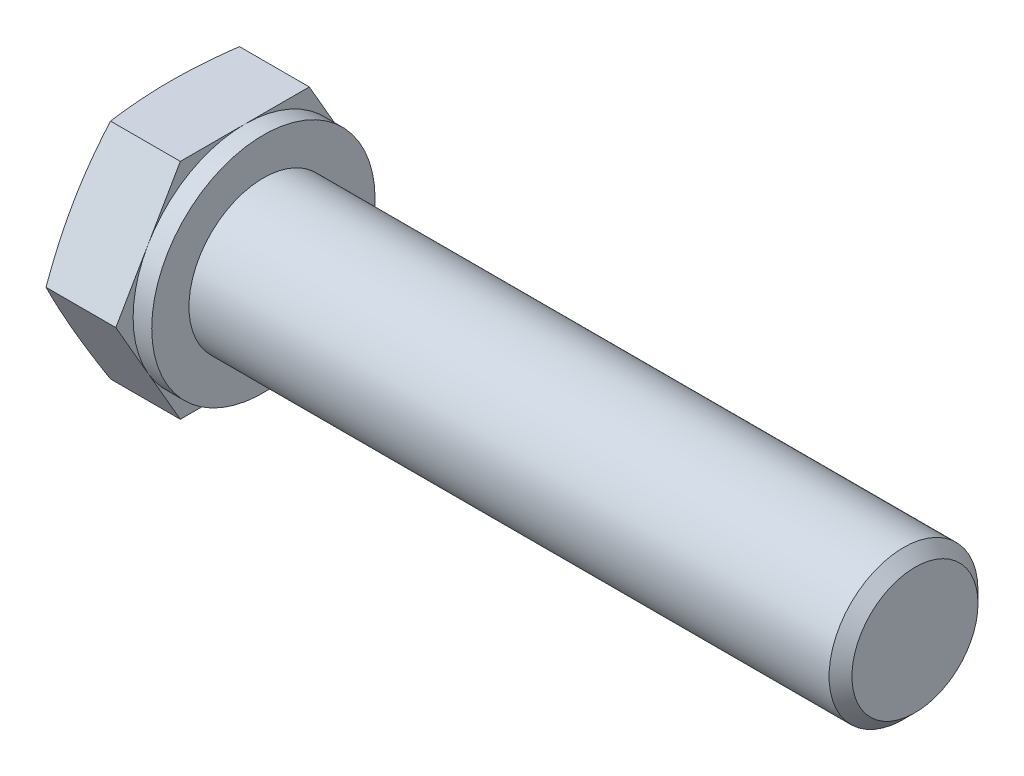
ISO-10303-21;
HEADER;
FILE_DESCRIPTION(('STEP AP214'),'2;1');
FILE_NAME('part.step','',(''),(''),'','','');
FILE_SCHEMA(('AUTOMOTIVE_DESIGN { 1 0 10303 214 1 1 1 1 }'));
ENDSEC;
DATA;
#1=APPLICATION_CONTEXT('core data for automotive mechanical design processes');
#2=APPLICATION_PROTOCOL_DEFINITION('international standard','automotive_design',2000,#1);
#3=PRODUCT_CONTEXT('',#1,'mechanical');
#4=PRODUCT('Part','Part','',(#3));
#5=PRODUCT_RELATED_PRODUCT_CATEGORY('part','',(#4));
#6=PRODUCT_DEFINITION_FORMATION('','',#4);
#7=PRODUCT_DEFINITION_CONTEXT('part definition',#1,'design');
#8=PRODUCT_DEFINITION('design','',#6,#7);
#9=PRODUCT_DEFINITION_SHAPE('','',#8);
#10=(LENGTH_UNIT() NAMED_UNIT(*) SI_UNIT(.MILLI.,.METRE.));
#11=(NAMED_UNIT(*) PLANE_ANGLE_UNIT() SI_UNIT($,.RADIAN.));
#12=(NAMED_UNIT(*) SI_UNIT($,.STERADIAN.) SOLID_ANGLE_UNIT());
#13=UNCERTAINTY_MEASURE_WITH_UNIT(LENGTH_MEASURE(1.E-05),#10,'distance_accuracy_value','');
#14=(GEOMETRIC_REPRESENTATION_CONTEXT(3) GLOBAL_UNCERTAINTY_ASSIGNED_CONTEXT((#13)) GLOBAL_UNIT_ASSIGNED_CONTEXT((#10,
#11,#12)) REPRESENTATION_CONTEXT('',''));
#15=CARTESIAN_POINT('',(0.,0.,0.));
#16=DIRECTION('',(0.,0.,1.));
#17=DIRECTION('',(1.,0.,0.));
#18=AXIS2_PLACEMENT_3D('',#15,#16,#17);
#19=CARTESIAN_POINT('',(10.,0.,13.856406460551));
#20=DIRECTION('',(0.,0.5,0.866025403784439));
#21=DIRECTION('',(1.,0.,0.));
#22=AXIS2_PLACEMENT_3D('',#19,#20,#21);
#23=PLANE('',#22);
#24=CARTESIAN_POINT('',(0.49742261192845,12.,6.9282032302755));
#25=CARTESIAN_POINT('',(0.25337690771278,10.4224637692121,7.8389941977773));
#26=CARTESIAN_POINT('',(0.131294031636191,8.99999999999998,8.66025403784438));
#27=CARTESIAN_POINT('',(0.,7.47021130957722,9.54347795006321));
#28=CARTESIAN_POINT('',(0.,5.99999999999998,10.3923048454133));
#29=B_SPLINE_CURVE_WITH_KNOTS('',2,(#24,#25,#26,#27,#28),.UNSPECIFIED.,.F.,.F.,(3,2,3),(0.,0.5,
1.),.UNSPECIFIED.);
#30=CARTESIAN_POINT('',(0.497422611928569,12.,6.92820323027551));
#31=VERTEX_POINT('',#30);
#32=CARTESIAN_POINT('',(0.,6.,10.3923048454133));
#33=VERTEX_POINT('',#32);
#34=EDGE_CURVE('E11',#31,#33,#29,.T.);
#35=ORIENTED_EDGE('',*,*,#34,.T.);
#36=CARTESIAN_POINT('',(0.,5.99999999999998,10.3923048454133));
#37=CARTESIAN_POINT('',(0.,4.53023836490945,11.2408721210774));
#38=CARTESIAN_POINT('',(0.131294031636191,2.99999999999998,12.1243556529821));
#39=CARTESIAN_POINT('',(0.25329635848283,1.5780569091953,12.9453148792305));
#40=CARTESIAN_POINT('',(0.49742261192845,0.,13.856406460551));
#41=B_SPLINE_CURVE_WITH_KNOTS('',2,(#36,#37,#38,#39,#40),.UNSPECIFIED.,.F.,.F.,(3,2,3),(0.,0.5,
1.),.UNSPECIFIED.);
#42=CARTESIAN_POINT('',(0.497422611928569,0.,13.856406460551));
#43=VERTEX_POINT('',#42);
#44=EDGE_CURVE('E29',#33,#43,#41,.T.);
#45=ORIENTED_EDGE('',*,*,#44,.T.);
#46=DIRECTION('',(-1.,0.,0.));
#47=VECTOR('',#46,1.);
#48=CARTESIAN_POINT('',(10.,0.,13.856406460551));
#49=LINE('',#48,#47);
#50=CARTESIAN_POINT('',(8.,0.,13.856406460551));
#51=VERTEX_POINT('',#50);
#52=EDGE_CURVE('E140',#51,#43,#49,.T.);
#53=ORIENTED_EDGE('',*,*,#52,.F.);
#54=DIRECTION('',(0.,0.866025403784439,-0.5));
#55=VECTOR('',#54,1.);
#56=CARTESIAN_POINT('',(8.,18.28125,3.30172185192817));
#57=LINE('',#56,#55);
#58=CARTESIAN_POINT('',(8.,6.,10.3923048454133));
#59=VERTEX_POINT('',#58);
#60=EDGE_CURVE('E143',#51,#59,#57,.T.);
#61=ORIENTED_EDGE('',*,*,#60,.T.);
#62=DIRECTION('',(0.,0.866025403784439,-0.5));
#63=VECTOR('',#62,1.);
#64=CARTESIAN_POINT('',(8.,18.28125,3.30172185192817));
#65=LINE('',#64,#63);
#66=CARTESIAN_POINT('',(8.,12.,6.92820323027551));
#67=VERTEX_POINT('',#66);
#68=EDGE_CURVE('E160',#59,#67,#65,.T.);
#69=ORIENTED_EDGE('',*,*,#68,.T.);
#70=DIRECTION('',(-1.,0.,0.));
#71=VECTOR('',#70,1.);
#72=CARTESIAN_POINT('',(10.,12.,6.92820323027551));
#73=LINE('',#72,#71);
#74=EDGE_CURVE('E299',#67,#31,#73,.T.);
#75=ORIENTED_EDGE('',*,*,#74,.T.);
#76=EDGE_LOOP('',(#35,#45,#53,#61,#69,#75));
#77=FACE_BOUND('',#76,.T.);
#78=ADVANCED_FACE('F16',(#77),#23,.T.);
#79=CARTESIAN_POINT('',(10.,-12.,6.92820323027551));
#80=DIRECTION('',(0.,-0.5,0.866025403784439));
#81=DIRECTION('',(-1.,0.,0.));
#82=AXIS2_PLACEMENT_3D('',#79,#80,#81);
#83=PLANE('',#82);
#84=CARTESIAN_POINT('',(0.49742261192845,0.,13.856406460551));
#85=CARTESIAN_POINT('',(0.253376907714091,-1.57753623077946,12.9456154930541));
#86=CARTESIAN_POINT('',(0.131294031636191,-3.,12.1243556529821));
#87=CARTESIAN_POINT('',(0.,-4.52978869041547,11.2411317407675));
#88=CARTESIAN_POINT('',(0.,-5.99999999999998,10.3923048454133));
#89=B_SPLINE_CURVE_WITH_KNOTS('',2,(#84,#85,#86,#87,#88),.UNSPECIFIED.,.F.,.F.,(3,2,3),(0.,0.5,
1.),.UNSPECIFIED.);
#90=CARTESIAN_POINT('',(0.,-6.,10.3923048454133));
#91=VERTEX_POINT('',#90);
#92=EDGE_CURVE('E296',#43,#91,#89,.T.);
#93=ORIENTED_EDGE('',*,*,#92,.T.);
#94=CARTESIAN_POINT('',(0.,-5.99999999999998,10.3923048454133));
#95=CARTESIAN_POINT('',(0.,-7.46976163505777,9.54373756976807));
#96=CARTESIAN_POINT('',(0.131294031636191,-9.,8.66025403784439));
#97=CARTESIAN_POINT('',(0.25329635847697,-10.4219430907668,7.83929481161785));
#98=CARTESIAN_POINT('',(0.49742261192845,-12.,6.92820323027551));
#99=B_SPLINE_CURVE_WITH_KNOTS('',2,(#94,#95,#96,#97,#98),.UNSPECIFIED.,.F.,.F.,(3,2,3),(0.,0.5,
1.),.UNSPECIFIED.);
#100=CARTESIAN_POINT('',(0.497422611928569,-12.,6.92820323027551));
#101=VERTEX_POINT('',#100);
#102=EDGE_CURVE('E171',#91,#101,#99,.T.);
#103=ORIENTED_EDGE('',*,*,#102,.T.);
#104=DIRECTION('',(-1.,0.,0.));
#105=VECTOR('',#104,1.);
#106=CARTESIAN_POINT('',(10.,-12.,6.92820323027551));
#107=LINE('',#106,#105);
#108=CARTESIAN_POINT('',(8.,-12.,6.92820323027551));
#109=VERTEX_POINT('',#108);
#110=EDGE_CURVE('E395',#109,#101,#107,.T.);
#111=ORIENTED_EDGE('',*,*,#110,.F.);
#112=DIRECTION('',(0.,0.866025403784439,0.5));
#113=VECTOR('',#112,1.);
#114=CARTESIAN_POINT('',(8.,6.28125,17.4828878388984));
#115=LINE('',#114,#113);
#116=CARTESIAN_POINT('',(8.,-6.,10.3923048454133));
#117=VERTEX_POINT('',#116);
#118=EDGE_CURVE('E164',#109,#117,#115,.T.);
#119=ORIENTED_EDGE('',*,*,#118,.T.);
#120=DIRECTION('',(0.,0.866025403784439,0.5));
#121=VECTOR('',#120,1.);
#122=CARTESIAN_POINT('',(8.,6.28125,17.4828878388984));
#123=LINE('',#122,#121);
#124=EDGE_CURVE('E151',#117,#51,#123,.T.);
#125=ORIENTED_EDGE('',*,*,#124,.T.);
#126=ORIENTED_EDGE('',*,*,#52,.T.);
#127=EDGE_LOOP('',(#93,#103,#111,#119,#125,#126));
#128=FACE_BOUND('',#127,.T.);
#129=ADVANCED_FACE('F162',(#128),#83,.T.);
#130=CARTESIAN_POINT('',(80.,6.773,0.));
#131=DIRECTION('',(-1.,0.,0.));
#132=DIRECTION('',(0.,0.,1.));
#133=AXIS2_PLACEMENT_3D('',#130,#131,#132);
#134=PLANE('',#133);
#135=CARTESIAN_POINT('',(80.,0.,0.));
#136=DIRECTION('',(1.,0.,0.));
#137=DIRECTION('',(0.,0.,-1.));
#138=AXIS2_PLACEMENT_3D('',#135,#136,#137);
#139=CIRCLE('',#138,6.773);
#140=CARTESIAN_POINT('',(80.,0.,-6.773));
#141=VERTEX_POINT('',#140);
#142=EDGE_CURVE('E152',#141,#141,#139,.T.);
#143=ORIENTED_EDGE('',*,*,#142,.T.);
#144=EDGE_LOOP('',(#143));
#145=FACE_BOUND('',#144,.T.);
#146=ADVANCED_FACE('F281',(#145),#134,.F.);
#147=CARTESIAN_POINT('',(78.773,0.,0.));
#148=DIRECTION('',(-1.,0.,0.));
#149=DIRECTION('',(0.,0.,1.));
#150=AXIS2_PLACEMENT_3D('',#147,#148,#149);
#151=CONICAL_SURFACE('',#150,8.,0.785398163397446);
#152=CARTESIAN_POINT('',(78.773,0.,0.));
#153=DIRECTION('',(1.,0.,0.));
#154=DIRECTION('',(0.,0.,-1.));
#155=AXIS2_PLACEMENT_3D('',#152,#153,#154);
#156=CIRCLE('',#155,8.);
#157=CARTESIAN_POINT('',(78.773,0.,-8.));
#158=VERTEX_POINT('',#157);
#159=EDGE_CURVE('E343',#158,#158,#156,.T.);
#160=ORIENTED_EDGE('',*,*,#159,.T.);
#161=EDGE_LOOP('',(#160));
#162=FACE_BOUND('',#161,.T.);
#163=ORIENTED_EDGE('',*,*,#142,.F.);
#164=EDGE_LOOP('',(#163));
#165=FACE_BOUND('',#164,.T.);
#166=ADVANCED_FACE('F494',(#162,#165),#151,.T.);
#167=CARTESIAN_POINT('',(80.,0.,0.));
#168=DIRECTION('',(-1.,0.,0.));
#169=DIRECTION('',(0.,0.,-1.));
#170=AXIS2_PLACEMENT_3D('',#167,#168,#169);
#171=CYLINDRICAL_SURFACE('',#170,8.);
#172=CARTESIAN_POINT('',(10.,0.,0.));
#173=DIRECTION('',(1.,0.,0.));
#174=DIRECTION('',(0.,0.,-1.));
#175=AXIS2_PLACEMENT_3D('',#172,#173,#174);
#176=CIRCLE('',#175,8.);
#177=CARTESIAN_POINT('',(10.,0.,-8.));
#178=VERTEX_POINT('',#177);
#179=EDGE_CURVE('E378',#178,#178,#176,.T.);
#180=ORIENTED_EDGE('',*,*,#179,.T.);
#181=EDGE_LOOP('',(#180));
#182=FACE_BOUND('',#181,.T.);
#183=ORIENTED_EDGE('',*,*,#159,.F.);
#184=EDGE_LOOP('',(#183));
#185=FACE_BOUND('',#184,.T.);
#186=ADVANCED_FACE('F18',(#182,#185),#171,.T.);
#187=CARTESIAN_POINT('',(10.,12.,0.));
#188=DIRECTION('',(-1.,0.,0.));
#189=DIRECTION('',(0.,0.,1.));
#190=AXIS2_PLACEMENT_3D('',#187,#188,#189);
#191=PLANE('',#190);
#192=CARTESIAN_POINT('',(10.,0.,0.));
#193=DIRECTION('',(1.,0.,0.));
#194=DIRECTION('',(0.,0.,-1.));
#195=AXIS2_PLACEMENT_3D('',#192,#193,#194);
#196=CIRCLE('',#195,12.);
#197=CARTESIAN_POINT('',(10.,0.,-12.));
#198=VERTEX_POINT('',#197);
#199=EDGE_CURVE('E374',#198,#198,#196,.T.);
#200=ORIENTED_EDGE('',*,*,#199,.T.);
#201=EDGE_LOOP('',(#200));
#202=FACE_BOUND('',#201,.T.);
#203=ORIENTED_EDGE('',*,*,#179,.F.);
#204=EDGE_LOOP('',(#203));
#205=FACE_BOUND('',#204,.T.);
#206=ADVANCED_FACE('F209',(#202,#205),#191,.F.);
#207=CARTESIAN_POINT('',(80.,0.,0.));
#208=DIRECTION('',(-1.,0.,0.));
#209=DIRECTION('',(0.,0.,-1.));
#210=AXIS2_PLACEMENT_3D('',#207,#208,#209);
#211=CYLINDRICAL_SURFACE('',#210,12.);
#212=CARTESIAN_POINT('',(8.,0.,0.));
#213=DIRECTION('',(1.,0.,0.));
#214=DIRECTION('',(0.,0.,-1.));
#215=AXIS2_PLACEMENT_3D('',#212,#213,#214);
#216=CIRCLE('',#215,12.);
#217=CARTESIAN_POINT('',(8.,12.,0.));
#218=VERTEX_POINT('',#217);
#219=EDGE_CURVE('E368',#218,#59,#216,.T.);
#220=ORIENTED_EDGE('',*,*,#219,.T.);
#221=CARTESIAN_POINT('',(8.,0.,0.));
#222=DIRECTION('',(1.,0.,0.));
#223=DIRECTION('',(0.,0.,-1.));
#224=AXIS2_PLACEMENT_3D('',#221,#222,#223);
#225=CIRCLE('',#224,12.);
#226=EDGE_CURVE('E158',#59,#117,#225,.T.);
#227=ORIENTED_EDGE('',*,*,#226,.T.);
#228=CARTESIAN_POINT('',(8.,0.,0.));
#229=DIRECTION('',(1.,0.,0.));
#230=DIRECTION('',(0.,0.,-1.));
#231=AXIS2_PLACEMENT_3D('',#228,#229,#230);
#232=CIRCLE('',#231,12.);
#233=CARTESIAN_POINT('',(8.,-12.,0.));
#234=VERTEX_POINT('',#233);
#235=EDGE_CURVE('E348',#117,#234,#232,.T.);
#236=ORIENTED_EDGE('',*,*,#235,.T.);
#237=CARTESIAN_POINT('',(8.,0.,0.));
#238=DIRECTION('',(1.,0.,0.));
#239=DIRECTION('',(0.,0.,-1.));
#240=AXIS2_PLACEMENT_3D('',#237,#238,#239);
#241=CIRCLE('',#240,12.);
#242=CARTESIAN_POINT('',(8.,-6.,-10.3923048454133));
#243=VERTEX_POINT('',#242);
#244=EDGE_CURVE('E320',#234,#243,#241,.T.);
#245=ORIENTED_EDGE('',*,*,#244,.T.);
#246=CARTESIAN_POINT('',(8.,0.,0.));
#247=DIRECTION('',(1.,0.,0.));
#248=DIRECTION('',(0.,0.,-1.));
#249=AXIS2_PLACEMENT_3D('',#246,#247,#248);
#250=CIRCLE('',#249,12.);
#251=CARTESIAN_POINT('',(8.,6.,-10.3923048454133));
#252=VERTEX_POINT('',#251);
#253=EDGE_CURVE('E181',#243,#252,#250,.T.);
#254=ORIENTED_EDGE('',*,*,#253,.T.);
#255=CARTESIAN_POINT('',(8.,0.,0.));
#256=DIRECTION('',(1.,0.,0.));
#257=DIRECTION('',(0.,0.,-1.));
#258=AXIS2_PLACEMENT_3D('',#255,#256,#257);
#259=CIRCLE('',#258,12.);
#260=EDGE_CURVE('E177',#252,#218,#259,.T.);
#261=ORIENTED_EDGE('',*,*,#260,.T.);
#262=EDGE_LOOP('',(#220,#227,#236,#245,#254,#261));
#263=FACE_BOUND('',#262,.T.);
#264=ORIENTED_EDGE('',*,*,#199,.F.);
#265=EDGE_LOOP('',(#264));
#266=FACE_BOUND('',#265,.T.);
#267=ADVANCED_FACE('F628',(#263,#266),#211,.T.);
#268=CARTESIAN_POINT('',(8.,16.375,0.));
#269=DIRECTION('',(-1.,0.,0.));
#270=DIRECTION('',(0.,0.,1.));
#271=AXIS2_PLACEMENT_3D('',#268,#269,#270);
#272=PLANE('',#271);
#273=DIRECTION('',(0.,-0.866025403784439,-0.5));
#274=VECTOR('',#273,1.);
#275=CARTESIAN_POINT('',(8.,18.28125,-3.30172185192817));
#276=LINE('',#275,#274);
#277=CARTESIAN_POINT('',(8.,12.,-6.92820323027551));
#278=VERTEX_POINT('',#277);
#279=EDGE_CURVE('E329',#278,#252,#276,.T.);
#280=ORIENTED_EDGE('',*,*,#279,.F.);
#281=DIRECTION('',(0.,0.,-1.));
#282=VECTOR('',#281,1.);
#283=CARTESIAN_POINT('',(8.,12.,0.));
#284=LINE('',#283,#282);
#285=EDGE_CURVE('E364',#218,#278,#284,.T.);
#286=ORIENTED_EDGE('',*,*,#285,.F.);
#287=ORIENTED_EDGE('',*,*,#260,.F.);
#288=EDGE_LOOP('',(#280,#286,#287));
#289=FACE_BOUND('',#288,.T.);
#290=ADVANCED_FACE('F533',(#289),#272,.F.);
#291=CARTESIAN_POINT('',(8.,16.375,0.));
#292=DIRECTION('',(-1.,0.,0.));
#293=DIRECTION('',(0.,0.,1.));
#294=AXIS2_PLACEMENT_3D('',#291,#292,#293);
#295=PLANE('',#294);
#296=DIRECTION('',(0.,-0.866025403784439,-0.5));
#297=VECTOR('',#296,1.);
#298=CARTESIAN_POINT('',(8.,18.28125,-3.30172185192817));
#299=LINE('',#298,#297);
#300=CARTESIAN_POINT('',(8.,0.,-13.856406460551));
#301=VERTEX_POINT('',#300);
#302=EDGE_CURVE('E326',#252,#301,#299,.T.);
#303=ORIENTED_EDGE('',*,*,#302,.F.);
#304=ORIENTED_EDGE('',*,*,#253,.F.);
#305=DIRECTION('',(0.,-0.866025403784439,0.5));
#306=VECTOR('',#305,1.);
#307=CARTESIAN_POINT('',(8.,6.28125,-17.4828878388984));
#308=LINE('',#307,#306);
#309=EDGE_CURVE('E183',#301,#243,#308,.T.);
#310=ORIENTED_EDGE('',*,*,#309,.F.);
#311=EDGE_LOOP('',(#303,#304,#310));
#312=FACE_BOUND('',#311,.T.);
#313=ADVANCED_FACE('F282',(#312),#295,.F.);
#314=CARTESIAN_POINT('',(8.,16.375,0.));
#315=DIRECTION('',(-1.,0.,0.));
#316=DIRECTION('',(0.,0.,1.));
#317=AXIS2_PLACEMENT_3D('',#314,#315,#316);
#318=PLANE('',#317);
#319=ORIENTED_EDGE('',*,*,#60,.F.);
#320=ORIENTED_EDGE('',*,*,#124,.F.);
#321=ORIENTED_EDGE('',*,*,#226,.F.);
#322=EDGE_LOOP('',(#319,#320,#321));
#323=FACE_BOUND('',#322,.T.);
#324=ADVANCED_FACE('F156',(#323),#318,.F.);
#325=CARTESIAN_POINT('',(8.,16.375,0.));
#326=DIRECTION('',(-1.,0.,0.));
#327=DIRECTION('',(0.,0.,1.));
#328=AXIS2_PLACEMENT_3D('',#325,#326,#327);
#329=PLANE('',#328);
#330=DIRECTION('',(0.,0.,1.));
#331=VECTOR('',#330,1.);
#332=CARTESIAN_POINT('',(8.,-12.,0.));
#333=LINE('',#332,#331);
#334=EDGE_CURVE('E391',#234,#109,#333,.T.);
#335=ORIENTED_EDGE('',*,*,#334,.F.);
#336=ORIENTED_EDGE('',*,*,#235,.F.);
#337=ORIENTED_EDGE('',*,*,#118,.F.);
#338=EDGE_LOOP('',(#335,#336,#337));
#339=FACE_BOUND('',#338,.T.);
#340=ADVANCED_FACE('F682',(#339),#329,.F.);
#341=CARTESIAN_POINT('',(8.,16.375,0.));
#342=DIRECTION('',(-1.,0.,0.));
#343=DIRECTION('',(0.,0.,1.));
#344=AXIS2_PLACEMENT_3D('',#341,#342,#343);
#345=PLANE('',#344);
#346=DIRECTION('',(0.,0.,-1.));
#347=VECTOR('',#346,1.);
#348=CARTESIAN_POINT('',(8.,12.,0.));
#349=LINE('',#348,#347);
#350=EDGE_CURVE('E360',#67,#218,#349,.T.);
#351=ORIENTED_EDGE('',*,*,#350,.F.);
#352=ORIENTED_EDGE('',*,*,#68,.F.);
#353=ORIENTED_EDGE('',*,*,#219,.F.);
#354=EDGE_LOOP('',(#351,#352,#353));
#355=FACE_BOUND('',#354,.T.);
#356=ADVANCED_FACE('F242',(#355),#345,.F.);
#357=CARTESIAN_POINT('',(10.,-12.,-6.92820323027551));
#358=DIRECTION('',(0.,-1.,0.));
#359=DIRECTION('',(0.,0.,-1.));
#360=AXIS2_PLACEMENT_3D('',#357,#358,#359);
#361=PLANE('',#360);
#362=CARTESIAN_POINT('',(0.497422611928569,-12.,6.92820323027551));
#363=CARTESIAN_POINT('',(0.253624152408091,-12.,5.10846675480059));
#364=CARTESIAN_POINT('',(0.1315456929334,-12.,3.46748646847153));
#365=CARTESIAN_POINT('',(0.,-12.,1.69924750326774));
#366=CARTESIAN_POINT('',(0.,-12.,0.));
#367=B_SPLINE_CURVE_WITH_KNOTS('',2,(#362,#363,#364,#365,#366),.UNSPECIFIED.,.F.,.F.,(3,2,3),
(0.,0.5,1.),.UNSPECIFIED.);
#368=CARTESIAN_POINT('',(0.,-12.,0.));
#369=VERTEX_POINT('',#368);
#370=EDGE_CURVE('E182',#101,#369,#367,.T.);
#371=ORIENTED_EDGE('',*,*,#370,.T.);
#372=CARTESIAN_POINT('',(0.,-12.,0.));
#373=CARTESIAN_POINT('',(0.,-12.,-1.69667649674607));
#374=CARTESIAN_POINT('',(0.131221771964779,-12.,-3.46312915573398));
#375=CARTESIAN_POINT('',(0.253225302137221,-12.,-5.10548969584963));
#376=CARTESIAN_POINT('',(0.497422611928569,-12.,-6.92820323027551));
#377=B_SPLINE_CURVE_WITH_KNOTS('',2,(#372,#373,#374,#375,#376),.UNSPECIFIED.,.F.,.F.,(3,2,3),
(0.,0.5,1.),.UNSPECIFIED.);
#378=CARTESIAN_POINT('',(0.497422611928569,-12.,-6.92820323027551));
#379=VERTEX_POINT('',#378);
#380=EDGE_CURVE('E459',#369,#379,#377,.T.);
#381=ORIENTED_EDGE('',*,*,#380,.T.);
#382=DIRECTION('',(-1.,0.,0.));
#383=VECTOR('',#382,1.);
#384=CARTESIAN_POINT('',(10.,-12.,-6.92820323027551));
#385=LINE('',#384,#383);
#386=CARTESIAN_POINT('',(8.,-12.,-6.92820323027551));
#387=VERTEX_POINT('',#386);
#388=EDGE_CURVE('E389',#387,#379,#385,.T.);
#389=ORIENTED_EDGE('',*,*,#388,.F.);
#390=DIRECTION('',(0.,0.,1.));
#391=VECTOR('',#390,1.);
#392=CARTESIAN_POINT('',(8.,-12.,0.));
#393=LINE('',#392,#391);
#394=EDGE_CURVE('E394',#387,#234,#393,.T.);
#395=ORIENTED_EDGE('',*,*,#394,.T.);
#396=ORIENTED_EDGE('',*,*,#334,.T.);
#397=ORIENTED_EDGE('',*,*,#110,.T.);
#398=EDGE_LOOP('',(#371,#381,#389,#395,#396,#397));
#399=FACE_BOUND('',#398,.T.);
#400=ADVANCED_FACE('F206',(#399),#361,.T.);
#401=CARTESIAN_POINT('',(10.,0.,-13.856406460551));
#402=DIRECTION('',(0.,-0.5,-0.866025403784439));
#403=DIRECTION('',(0.,-0.866025403784439,0.5));
#404=AXIS2_PLACEMENT_3D('',#401,#402,#403);
#405=PLANE('',#404);
#406=CARTESIAN_POINT('',(0.497422611928446,-12.,-6.9282032302755));
#407=CARTESIAN_POINT('',(0.253376907712776,-10.4224637692121,-7.8389941977773));
#408=CARTESIAN_POINT('',(0.131294031636175,-8.99999999999998,-8.66025403784438));
#409=CARTESIAN_POINT('',(0.,-7.47021130957722,-9.54347795006321));
#410=CARTESIAN_POINT('',(0.,-5.99999999999998,-10.3923048454133));
#411=B_SPLINE_CURVE_WITH_KNOTS('',2,(#406,#407,#408,#409,#410),.UNSPECIFIED.,.F.,.F.,(3,2,3),
(0.,0.5,1.),.UNSPECIFIED.);
#412=CARTESIAN_POINT('',(0.,-6.,-10.3923048454133));
#413=VERTEX_POINT('',#412);
#414=EDGE_CURVE('E373',#379,#413,#411,.T.);
#415=ORIENTED_EDGE('',*,*,#414,.T.);
#416=CARTESIAN_POINT('',(0.,-5.99999999999998,-10.3923048454133));
#417=CARTESIAN_POINT('',(0.,-4.53023836490945,-11.2408721210774));
#418=CARTESIAN_POINT('',(0.131294031636175,-2.99999999999998,-12.1243556529821));
#419=CARTESIAN_POINT('',(0.253296358482827,-1.5780569091953,-12.9453148792305));
#420=CARTESIAN_POINT('',(0.497422611928446,0.,-13.856406460551));
#421=B_SPLINE_CURVE_WITH_KNOTS('',2,(#416,#417,#418,#419,#420),.UNSPECIFIED.,.F.,.F.,(3,2,3),
(0.,0.5,1.),.UNSPECIFIED.);
#422=CARTESIAN_POINT('',(0.497422611928569,0.,-13.856406460551));
#423=VERTEX_POINT('',#422);
#424=EDGE_CURVE('E187',#413,#423,#421,.T.);
#425=ORIENTED_EDGE('',*,*,#424,.T.);
#426=DIRECTION('',(-1.,0.,0.));
#427=VECTOR('',#426,1.);
#428=CARTESIAN_POINT('',(10.,0.,-13.856406460551));
#429=LINE('',#428,#427);
#430=EDGE_CURVE('E330',#301,#423,#429,.T.);
#431=ORIENTED_EDGE('',*,*,#430,.F.);
#432=ORIENTED_EDGE('',*,*,#309,.T.);
#433=DIRECTION('',(0.,-0.866025403784439,0.5));
#434=VECTOR('',#433,1.);
#435=CARTESIAN_POINT('',(8.,6.28125,-17.4828878388984));
#436=LINE('',#435,#434);
#437=EDGE_CURVE('E175',#243,#387,#436,.T.);
#438=ORIENTED_EDGE('',*,*,#437,.T.);
#439=ORIENTED_EDGE('',*,*,#388,.T.);
#440=EDGE_LOOP('',(#415,#425,#431,#432,#438,#439));
#441=FACE_BOUND('',#440,.T.);
#442=ADVANCED_FACE('F432',(#441),#405,.T.);
#443=CARTESIAN_POINT('',(0.,0.,0.));
#444=DIRECTION('',(1.,0.,0.));
#445=DIRECTION('',(0.,0.,-1.));
#446=AXIS2_PLACEMENT_3D('',#443,#444,#445);
#447=CONICAL_SURFACE('',#446,12.,1.30899693899574);
#448=ORIENTED_EDGE('',*,*,#380,.F.);
#449=CARTESIAN_POINT('',(0.,0.,0.));
#450=DIRECTION('',(1.,0.,0.));
#451=DIRECTION('',(0.,0.,-1.));
#452=AXIS2_PLACEMENT_3D('',#449,#450,#451);
#453=CIRCLE('',#452,12.);
#454=EDGE_CURVE('E303',#369,#413,#453,.T.);
#455=ORIENTED_EDGE('',*,*,#454,.T.);
#456=ORIENTED_EDGE('',*,*,#414,.F.);
#457=EDGE_LOOP('',(#448,#455,#456));
#458=FACE_BOUND('',#457,.T.);
#459=ADVANCED_FACE('F441',(#458),#447,.T.);
#460=CARTESIAN_POINT('',(0.,0.,0.));
#461=DIRECTION('',(1.,0.,0.));
#462=DIRECTION('',(0.,0.,-1.));
#463=AXIS2_PLACEMENT_3D('',#460,#461,#462);
#464=CONICAL_SURFACE('',#463,12.,1.30899693899574);
#465=ORIENTED_EDGE('',*,*,#424,.F.);
#466=CARTESIAN_POINT('',(0.,0.,0.));
#467=DIRECTION('',(1.,0.,0.));
#468=DIRECTION('',(0.,0.,-1.));
#469=AXIS2_PLACEMENT_3D('',#466,#467,#468);
#470=CIRCLE('',#469,12.);
#471=CARTESIAN_POINT('',(0.,6.,-10.3923048454133));
#472=VERTEX_POINT('',#471);
#473=EDGE_CURVE('E324',#413,#472,#470,.T.);
#474=ORIENTED_EDGE('',*,*,#473,.T.);
#475=CARTESIAN_POINT('',(0.49742261192845,0.,-13.856406460551));
#476=CARTESIAN_POINT('',(0.253376907714091,1.57753623077946,-12.9456154930541));
#477=CARTESIAN_POINT('',(0.131294031636191,3.,-12.1243556529821));
#478=CARTESIAN_POINT('',(0.,4.52978869041547,-11.2411317407675));
#479=CARTESIAN_POINT('',(0.,5.99999999999998,-10.3923048454133));
#480=B_SPLINE_CURVE_WITH_KNOTS('',2,(#475,#476,#477,#478,#479),.UNSPECIFIED.,.F.,.F.,(3,2,3),
(0.,0.5,1.),.UNSPECIFIED.);
#481=EDGE_CURVE('E314',#423,#472,#480,.T.);
#482=ORIENTED_EDGE('',*,*,#481,.F.);
#483=EDGE_LOOP('',(#465,#474,#482));
#484=FACE_BOUND('',#483,.T.);
#485=ADVANCED_FACE('F238',(#484),#464,.T.);
#486=CARTESIAN_POINT('',(0.,0.,0.));
#487=DIRECTION('',(1.,0.,0.));
#488=DIRECTION('',(0.,0.,-1.));
#489=AXIS2_PLACEMENT_3D('',#486,#487,#488);
#490=CONICAL_SURFACE('',#489,12.,1.30899693899574);
#491=ORIENTED_EDGE('',*,*,#44,.F.);
#492=CARTESIAN_POINT('',(0.,0.,0.));
#493=DIRECTION('',(1.,0.,0.));
#494=DIRECTION('',(0.,0.,-1.));
#495=AXIS2_PLACEMENT_3D('',#492,#493,#494);
#496=CIRCLE('',#495,12.);
#497=EDGE_CURVE('E41',#33,#91,#496,.T.);
#498=ORIENTED_EDGE('',*,*,#497,.T.);
#499=ORIENTED_EDGE('',*,*,#92,.F.);
#500=EDGE_LOOP('',(#491,#498,#499));
#501=FACE_BOUND('',#500,.T.);
#502=ADVANCED_FACE('F228',(#501),#490,.T.);
#503=CARTESIAN_POINT('',(0.,0.,0.));
#504=DIRECTION('',(1.,0.,0.));
#505=DIRECTION('',(0.,0.,-1.));
#506=AXIS2_PLACEMENT_3D('',#503,#504,#505);
#507=CONICAL_SURFACE('',#506,12.,1.30899693899574);
#508=ORIENTED_EDGE('',*,*,#370,.F.);
#509=ORIENTED_EDGE('',*,*,#102,.F.);
#510=CARTESIAN_POINT('',(0.,0.,0.));
#511=DIRECTION('',(1.,0.,0.));
#512=DIRECTION('',(0.,0.,-1.));
#513=AXIS2_PLACEMENT_3D('',#510,#511,#512);
#514=CIRCLE('',#513,12.);
#515=EDGE_CURVE('E251',#91,#369,#514,.T.);
#516=ORIENTED_EDGE('',*,*,#515,.T.);
#517=EDGE_LOOP('',(#508,#509,#516));
#518=FACE_BOUND('',#517,.T.);
#519=ADVANCED_FACE('F237',(#518),#507,.T.);
#520=CARTESIAN_POINT('',(0.,0.,0.));
#521=DIRECTION('',(1.,0.,0.));
#522=DIRECTION('',(0.,1.,0.));
#523=AXIS2_PLACEMENT_3D('',#520,#521,#522);
#524=PLANE('',#523);
#525=CARTESIAN_POINT('',(0.,0.,0.));
#526=DIRECTION('',(1.,0.,0.));
#527=DIRECTION('',(0.,0.,-1.));
#528=AXIS2_PLACEMENT_3D('',#525,#526,#527);
#529=CIRCLE('',#528,12.);
#530=CARTESIAN_POINT('',(0.,12.,0.));
#531=VERTEX_POINT('',#530);
#532=EDGE_CURVE('E332',#531,#33,#529,.T.);
#533=ORIENTED_EDGE('',*,*,#532,.F.);
#534=CARTESIAN_POINT('',(0.,0.,0.));
#535=DIRECTION('',(1.,0.,0.));
#536=DIRECTION('',(0.,0.,-1.));
#537=AXIS2_PLACEMENT_3D('',#534,#535,#536);
#538=CIRCLE('',#537,12.);
#539=EDGE_CURVE('E260',#472,#531,#538,.T.);
#540=ORIENTED_EDGE('',*,*,#539,.F.);
#541=ORIENTED_EDGE('',*,*,#473,.F.);
#542=ORIENTED_EDGE('',*,*,#454,.F.);
#543=ORIENTED_EDGE('',*,*,#515,.F.);
#544=ORIENTED_EDGE('',*,*,#497,.F.);
#545=EDGE_LOOP('',(#533,#540,#541,#542,#543,#544));
#546=FACE_BOUND('',#545,.T.);
#547=ADVANCED_FACE('F300',(#546),#524,.F.);
#548=CARTESIAN_POINT('',(0.,0.,0.));
#549=DIRECTION('',(1.,0.,0.));
#550=DIRECTION('',(0.,0.,-1.));
#551=AXIS2_PLACEMENT_3D('',#548,#549,#550);
#552=CONICAL_SURFACE('',#551,12.,1.30899693899574);
#553=CARTESIAN_POINT('',(0.,5.99999999999998,-10.3923048454133));
#554=CARTESIAN_POINT('',(0.,7.46976163506143,-9.54373756976596));
#555=CARTESIAN_POINT('',(0.131294031636191,9.00000000000001,-8.66025403784438));
#556=CARTESIAN_POINT('',(0.253296358477621,10.421943090771,-7.83929481161541));
#557=CARTESIAN_POINT('',(0.49742261192845,12.,-6.92820323027551));
#558=B_SPLINE_CURVE_WITH_KNOTS('',2,(#553,#554,#555,#556,#557),.UNSPECIFIED.,.F.,.F.,(3,2,3),
(0.,0.5,1.),.UNSPECIFIED.);
#559=CARTESIAN_POINT('',(0.497422611928569,12.,-6.92820323027551));
#560=VERTEX_POINT('',#559);
#561=EDGE_CURVE('E520',#472,#560,#558,.T.);
#562=ORIENTED_EDGE('',*,*,#561,.F.);
#563=ORIENTED_EDGE('',*,*,#539,.T.);
#564=CARTESIAN_POINT('',(0.497422611928569,12.,-6.92820323027551));
#565=CARTESIAN_POINT('',(0.253306105500921,12.,-5.10609282036709));
#566=CARTESIAN_POINT('',(0.131221771964779,12.,-3.46312915573399));
#567=CARTESIAN_POINT('',(0.,12.,-1.69719738461854));
#568=CARTESIAN_POINT('',(0.,12.,0.));
#569=B_SPLINE_CURVE_WITH_KNOTS('',2,(#564,#565,#566,#567,#568),.UNSPECIFIED.,.F.,.F.,(3,2,3),
(0.,0.5,1.),.UNSPECIFIED.);
#570=EDGE_CURVE('E335',#560,#531,#569,.T.);
#571=ORIENTED_EDGE('',*,*,#570,.F.);
#572=EDGE_LOOP('',(#562,#563,#571));
#573=FACE_BOUND('',#572,.T.);
#574=ADVANCED_FACE('F239',(#573),#552,.T.);
#575=CARTESIAN_POINT('',(0.,0.,0.));
#576=DIRECTION('',(1.,0.,0.));
#577=DIRECTION('',(0.,0.,-1.));
#578=AXIS2_PLACEMENT_3D('',#575,#576,#577);
#579=CONICAL_SURFACE('',#578,12.,1.30899693899574);
#580=CARTESIAN_POINT('',(0.,12.,0.));
#581=CARTESIAN_POINT('',(0.,12.,1.69872759164872));
#582=CARTESIAN_POINT('',(0.1315456929334,12.,3.46748646847153));
#583=CARTESIAN_POINT('',(0.25354349293356,12.,5.10786470428649));
#584=CARTESIAN_POINT('',(0.497422611928569,12.,6.92820323027551));
#585=B_SPLINE_CURVE_WITH_KNOTS('',2,(#580,#581,#582,#583,#584),.UNSPECIFIED.,.F.,.F.,(3,2,3),
(0.,0.5,1.),.UNSPECIFIED.);
#586=EDGE_CURVE('E352',#531,#31,#585,.T.);
#587=ORIENTED_EDGE('',*,*,#586,.F.);
#588=ORIENTED_EDGE('',*,*,#532,.T.);
#589=ORIENTED_EDGE('',*,*,#34,.F.);
#590=EDGE_LOOP('',(#587,#588,#589));
#591=FACE_BOUND('',#590,.T.);
#592=ADVANCED_FACE('F284',(#591),#579,.T.);
#593=CARTESIAN_POINT('',(10.,12.,6.92820323027551));
#594=DIRECTION('',(0.,1.,0.));
#595=DIRECTION('',(1.,0.,0.));
#596=AXIS2_PLACEMENT_3D('',#593,#594,#595);
#597=PLANE('',#596);
#598=ORIENTED_EDGE('',*,*,#570,.T.);
#599=ORIENTED_EDGE('',*,*,#586,.T.);
#600=ORIENTED_EDGE('',*,*,#74,.F.);
#601=ORIENTED_EDGE('',*,*,#350,.T.);
#602=ORIENTED_EDGE('',*,*,#285,.T.);
#603=DIRECTION('',(-1.,0.,0.));
#604=VECTOR('',#603,1.);
#605=CARTESIAN_POINT('',(10.,12.,-6.92820323027551));
#606=LINE('',#605,#604);
#607=EDGE_CURVE('E573',#278,#560,#606,.T.);
#608=ORIENTED_EDGE('',*,*,#607,.T.);
#609=EDGE_LOOP('',(#598,#599,#600,#601,#602,#608));
#610=FACE_BOUND('',#609,.T.);
#611=ADVANCED_FACE('F442',(#610),#597,.T.);
#612=CARTESIAN_POINT('',(10.,12.,-6.92820323027551));
#613=DIRECTION('',(0.,0.5,-0.866025403784439));
#614=DIRECTION('',(-1.,0.,0.));
#615=AXIS2_PLACEMENT_3D('',#612,#613,#614);
#616=PLANE('',#615);
#617=ORIENTED_EDGE('',*,*,#481,.T.);
#618=ORIENTED_EDGE('',*,*,#561,.T.);
#619=ORIENTED_EDGE('',*,*,#607,.F.);
#620=ORIENTED_EDGE('',*,*,#279,.T.);
#621=ORIENTED_EDGE('',*,*,#302,.T.);
#622=ORIENTED_EDGE('',*,*,#430,.T.);
#623=EDGE_LOOP('',(#617,#618,#619,#620,#621,#622));
#624=FACE_BOUND('',#623,.T.);
#625=ADVANCED_FACE('F524',(#624),#616,.T.);
#626=CARTESIAN_POINT('',(8.,16.375,0.));
#627=DIRECTION('',(-1.,0.,0.));
#628=DIRECTION('',(0.,0.,1.));
#629=AXIS2_PLACEMENT_3D('',#626,#627,#628);
#630=PLANE('',#629);
#631=ORIENTED_EDGE('',*,*,#437,.F.);
#632=ORIENTED_EDGE('',*,*,#244,.F.);
#633=ORIENTED_EDGE('',*,*,#394,.F.);
#634=EDGE_LOOP('',(#631,#632,#633));
#635=FACE_BOUND('',#634,.T.);
#636=ADVANCED_FACE('F532',(#635),#630,.F.);
#637=CLOSED_SHELL('',(#78,#129,#146,#166,#186,#206,#267,#290,#313,#324,#340,#356,#400,#442,#459,
#485,#502,#519,#547,#574,#592,#611,#625,#636));
#638=MANIFOLD_SOLID_BREP('B1',#637);
#639=ADVANCED_BREP_SHAPE_REPRESENTATION('',(#18,#638),#14);
#640=SHAPE_DEFINITION_REPRESENTATION(#9,#639);
ENDSEC;
END-ISO-10303-21;
